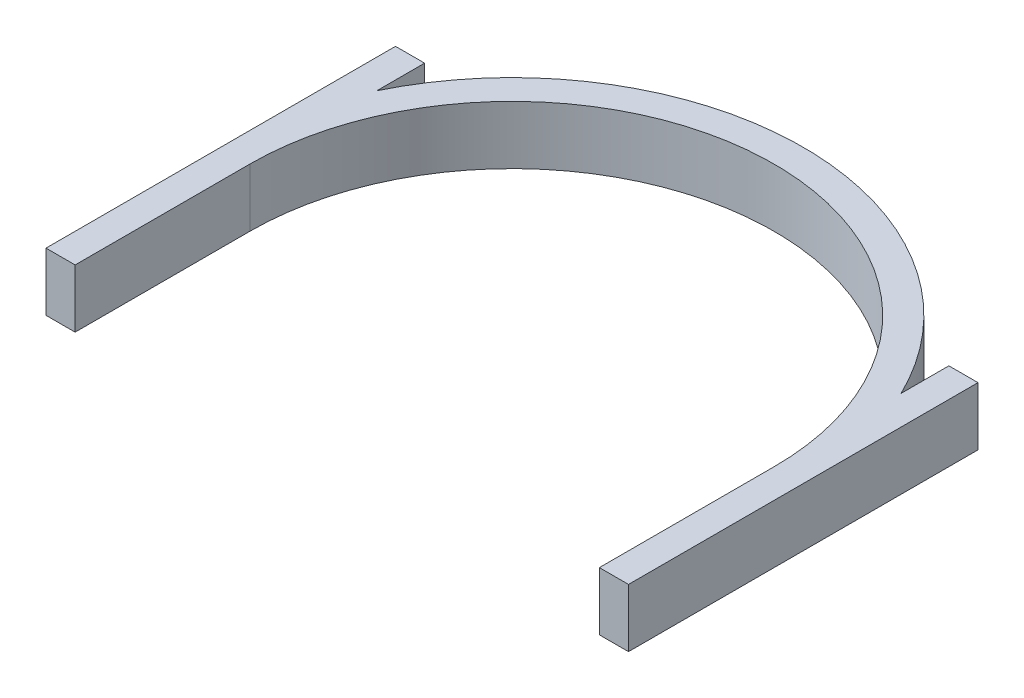
ISO-10303-21;
HEADER;
FILE_DESCRIPTION(('STEP AP214'),'2;1');
FILE_NAME('part.step','',(''),(''),'','','');
FILE_SCHEMA(('AUTOMOTIVE_DESIGN { 1 0 10303 214 1 1 1 1 }'));
ENDSEC;
DATA;
#1=APPLICATION_CONTEXT('core data for automotive mechanical design processes');
#2=APPLICATION_PROTOCOL_DEFINITION('international standard','automotive_design',2000,#1);
#3=PRODUCT_CONTEXT('',#1,'mechanical');
#4=PRODUCT('Part','Part','',(#3));
#5=PRODUCT_RELATED_PRODUCT_CATEGORY('part','',(#4));
#6=PRODUCT_DEFINITION_FORMATION('','',#4);
#7=PRODUCT_DEFINITION_CONTEXT('part definition',#1,'design');
#8=PRODUCT_DEFINITION('design','',#6,#7);
#9=PRODUCT_DEFINITION_SHAPE('','',#8);
#10=(LENGTH_UNIT() NAMED_UNIT(*) SI_UNIT(.MILLI.,.METRE.));
#11=(NAMED_UNIT(*) PLANE_ANGLE_UNIT() SI_UNIT($,.RADIAN.));
#12=(NAMED_UNIT(*) SI_UNIT($,.STERADIAN.) SOLID_ANGLE_UNIT());
#13=UNCERTAINTY_MEASURE_WITH_UNIT(LENGTH_MEASURE(1.E-05),#10,'distance_accuracy_value','');
#14=(GEOMETRIC_REPRESENTATION_CONTEXT(3) GLOBAL_UNCERTAINTY_ASSIGNED_CONTEXT((#13)) GLOBAL_UNIT_ASSIGNED_CONTEXT((#10,
#11,#12)) REPRESENTATION_CONTEXT('',''));
#15=CARTESIAN_POINT('',(0.,0.,0.));
#16=DIRECTION('',(0.,0.,1.));
#17=DIRECTION('',(1.,0.,0.));
#18=AXIS2_PLACEMENT_3D('',#15,#16,#17);
#19=CARTESIAN_POINT('',(0.,10.,0.));
#20=DIRECTION('',(0.,-1.,0.));
#21=DIRECTION('',(0.,0.,-1.));
#22=AXIS2_PLACEMENT_3D('',#19,#20,#21);
#23=CYLINDRICAL_SURFACE('',#22,50.);
#24=CARTESIAN_POINT('',(0.,0.,0.));
#25=DIRECTION('',(0.,1.,0.));
#26=DIRECTION('',(0.,0.,1.));
#27=AXIS2_PLACEMENT_3D('',#24,#25,#26);
#28=CIRCLE('',#27,50.);
#29=CARTESIAN_POINT('',(45.,0.,-21.7944947177034));
#30=VERTEX_POINT('',#29);
#31=CARTESIAN_POINT('',(-45.,0.,-21.7944947177034));
#32=VERTEX_POINT('',#31);
#33=EDGE_CURVE('E154',#30,#32,#28,.T.);
#34=ORIENTED_EDGE('',*,*,#33,.T.);
#35=DIRECTION('',(0.,-1.,0.));
#36=VECTOR('',#35,1.);
#37=CARTESIAN_POINT('',(-45.,10.,-21.7944947177034));
#38=LINE('',#37,#36);
#39=CARTESIAN_POINT('',(-45.,10.,-21.7944947177034));
#40=VERTEX_POINT('',#39);
#41=EDGE_CURVE('E11',#40,#32,#38,.T.);
#42=ORIENTED_EDGE('',*,*,#41,.F.);
#43=CARTESIAN_POINT('',(0.,10.,0.));
#44=DIRECTION('',(0.,1.,0.));
#45=DIRECTION('',(0.,0.,1.));
#46=AXIS2_PLACEMENT_3D('',#43,#44,#45);
#47=CIRCLE('',#46,50.);
#48=CARTESIAN_POINT('',(45.,10.,-21.7944947177034));
#49=VERTEX_POINT('',#48);
#50=EDGE_CURVE('E176',#49,#40,#47,.T.);
#51=ORIENTED_EDGE('',*,*,#50,.F.);
#52=DIRECTION('',(0.,-1.,0.));
#53=VECTOR('',#52,1.);
#54=CARTESIAN_POINT('',(45.,10.,-21.7944947177034));
#55=LINE('',#54,#53);
#56=EDGE_CURVE('E150',#49,#30,#55,.T.);
#57=ORIENTED_EDGE('',*,*,#56,.T.);
#58=EDGE_LOOP('',(#34,#42,#51,#57));
#59=FACE_BOUND('',#58,.T.);
#60=ADVANCED_FACE('F34',(#59),#23,.T.);
#61=CARTESIAN_POINT('',(-45.,10.,-30.));
#62=DIRECTION('',(-1.,0.,0.));
#63=DIRECTION('',(0.,0.,1.));
#64=AXIS2_PLACEMENT_3D('',#61,#62,#63);
#65=PLANE('',#64);
#66=DIRECTION('',(0.,0.,-1.));
#67=VECTOR('',#66,1.);
#68=CARTESIAN_POINT('',(-45.,0.,-30.));
#69=LINE('',#68,#67);
#70=CARTESIAN_POINT('',(-45.,0.,-30.));
#71=VERTEX_POINT('',#70);
#72=EDGE_CURVE('E157',#32,#71,#69,.T.);
#73=ORIENTED_EDGE('',*,*,#72,.T.);
#74=DIRECTION('',(0.,-1.,0.));
#75=VECTOR('',#74,1.);
#76=CARTESIAN_POINT('',(-45.,10.,-30.));
#77=LINE('',#76,#75);
#78=CARTESIAN_POINT('',(-45.,10.,-30.));
#79=VERTEX_POINT('',#78);
#80=EDGE_CURVE('E42',#79,#71,#77,.T.);
#81=ORIENTED_EDGE('',*,*,#80,.F.);
#82=DIRECTION('',(0.,0.,-1.));
#83=VECTOR('',#82,1.);
#84=CARTESIAN_POINT('',(-45.,10.,-30.));
#85=LINE('',#84,#83);
#86=EDGE_CURVE('E105',#40,#79,#85,.T.);
#87=ORIENTED_EDGE('',*,*,#86,.F.);
#88=ORIENTED_EDGE('',*,*,#41,.T.);
#89=EDGE_LOOP('',(#73,#81,#87,#88));
#90=FACE_BOUND('',#89,.T.);
#91=ADVANCED_FACE('F254',(#90),#65,.F.);
#92=CARTESIAN_POINT('',(-50.,10.,-30.));
#93=DIRECTION('',(0.,0.,1.));
#94=DIRECTION('',(1.,0.,0.));
#95=AXIS2_PLACEMENT_3D('',#92,#93,#94);
#96=PLANE('',#95);
#97=DIRECTION('',(-1.,0.,0.));
#98=VECTOR('',#97,1.);
#99=CARTESIAN_POINT('',(-50.,0.,-30.));
#100=LINE('',#99,#98);
#101=CARTESIAN_POINT('',(-50.,0.,-30.));
#102=VERTEX_POINT('',#101);
#103=EDGE_CURVE('E159',#71,#102,#100,.T.);
#104=ORIENTED_EDGE('',*,*,#103,.T.);
#105=DIRECTION('',(0.,-1.,0.));
#106=VECTOR('',#105,1.);
#107=CARTESIAN_POINT('',(-50.,10.,-30.));
#108=LINE('',#107,#106);
#109=CARTESIAN_POINT('',(-50.,10.,-30.));
#110=VERTEX_POINT('',#109);
#111=EDGE_CURVE('E195',#110,#102,#108,.T.);
#112=ORIENTED_EDGE('',*,*,#111,.F.);
#113=DIRECTION('',(-1.,0.,0.));
#114=VECTOR('',#113,1.);
#115=CARTESIAN_POINT('',(-50.,10.,-30.));
#116=LINE('',#115,#114);
#117=EDGE_CURVE('E203',#79,#110,#116,.T.);
#118=ORIENTED_EDGE('',*,*,#117,.F.);
#119=ORIENTED_EDGE('',*,*,#80,.T.);
#120=EDGE_LOOP('',(#104,#112,#118,#119));
#121=FACE_BOUND('',#120,.T.);
#122=ADVANCED_FACE('F201',(#121),#96,.F.);
#123=CARTESIAN_POINT('',(-50.,10.,-30.));
#124=DIRECTION('',(1.,0.,0.));
#125=DIRECTION('',(0.,0.,-1.));
#126=AXIS2_PLACEMENT_3D('',#123,#124,#125);
#127=PLANE('',#126);
#128=DIRECTION('',(0.,0.,1.));
#129=VECTOR('',#128,1.);
#130=CARTESIAN_POINT('',(-50.,0.,-30.));
#131=LINE('',#130,#129);
#132=CARTESIAN_POINT('',(-50.,0.,30.));
#133=VERTEX_POINT('',#132);
#134=EDGE_CURVE('E161',#102,#133,#131,.T.);
#135=ORIENTED_EDGE('',*,*,#134,.T.);
#136=DIRECTION('',(0.,-1.,0.));
#137=VECTOR('',#136,1.);
#138=CARTESIAN_POINT('',(-50.,10.,30.));
#139=LINE('',#138,#137);
#140=CARTESIAN_POINT('',(-50.,10.,30.));
#141=VERTEX_POINT('',#140);
#142=EDGE_CURVE('E192',#141,#133,#139,.T.);
#143=ORIENTED_EDGE('',*,*,#142,.F.);
#144=DIRECTION('',(0.,0.,1.));
#145=VECTOR('',#144,1.);
#146=CARTESIAN_POINT('',(-50.,10.,-30.));
#147=LINE('',#146,#145);
#148=EDGE_CURVE('E221',#110,#141,#147,.T.);
#149=ORIENTED_EDGE('',*,*,#148,.F.);
#150=ORIENTED_EDGE('',*,*,#111,.T.);
#151=EDGE_LOOP('',(#135,#143,#149,#150));
#152=FACE_BOUND('',#151,.T.);
#153=ADVANCED_FACE('F212',(#152),#127,.F.);
#154=CARTESIAN_POINT('',(-50.,10.,30.));
#155=DIRECTION('',(0.,0.,-1.));
#156=DIRECTION('',(-1.,0.,0.));
#157=AXIS2_PLACEMENT_3D('',#154,#155,#156);
#158=PLANE('',#157);
#159=DIRECTION('',(1.,0.,0.));
#160=VECTOR('',#159,1.);
#161=CARTESIAN_POINT('',(-50.,0.,30.));
#162=LINE('',#161,#160);
#163=CARTESIAN_POINT('',(-45.,0.,30.));
#164=VERTEX_POINT('',#163);
#165=EDGE_CURVE('E163',#133,#164,#162,.T.);
#166=ORIENTED_EDGE('',*,*,#165,.T.);
#167=DIRECTION('',(0.,-1.,0.));
#168=VECTOR('',#167,1.);
#169=CARTESIAN_POINT('',(-45.,10.,30.));
#170=LINE('',#169,#168);
#171=CARTESIAN_POINT('',(-45.,10.,30.));
#172=VERTEX_POINT('',#171);
#173=EDGE_CURVE('E189',#172,#164,#170,.T.);
#174=ORIENTED_EDGE('',*,*,#173,.F.);
#175=DIRECTION('',(1.,0.,0.));
#176=VECTOR('',#175,1.);
#177=CARTESIAN_POINT('',(-50.,10.,30.));
#178=LINE('',#177,#176);
#179=EDGE_CURVE('E218',#141,#172,#178,.T.);
#180=ORIENTED_EDGE('',*,*,#179,.F.);
#181=ORIENTED_EDGE('',*,*,#142,.T.);
#182=EDGE_LOOP('',(#166,#174,#180,#181));
#183=FACE_BOUND('',#182,.T.);
#184=ADVANCED_FACE('F216',(#183),#158,.F.);
#185=CARTESIAN_POINT('',(-45.,10.,0.));
#186=DIRECTION('',(-1.,0.,0.));
#187=DIRECTION('',(0.,0.,1.));
#188=AXIS2_PLACEMENT_3D('',#185,#186,#187);
#189=PLANE('',#188);
#190=DIRECTION('',(0.,0.,-1.));
#191=VECTOR('',#190,1.);
#192=CARTESIAN_POINT('',(-45.,0.,0.));
#193=LINE('',#192,#191);
#194=CARTESIAN_POINT('',(-45.,0.,0.));
#195=VERTEX_POINT('',#194);
#196=EDGE_CURVE('E165',#164,#195,#193,.T.);
#197=ORIENTED_EDGE('',*,*,#196,.T.);
#198=DIRECTION('',(0.,-1.,0.));
#199=VECTOR('',#198,1.);
#200=CARTESIAN_POINT('',(-45.,10.,0.));
#201=LINE('',#200,#199);
#202=CARTESIAN_POINT('',(-45.,10.,0.));
#203=VERTEX_POINT('',#202);
#204=EDGE_CURVE('E186',#203,#195,#201,.T.);
#205=ORIENTED_EDGE('',*,*,#204,.F.);
#206=DIRECTION('',(0.,0.,-1.));
#207=VECTOR('',#206,1.);
#208=CARTESIAN_POINT('',(-45.,10.,0.));
#209=LINE('',#208,#207);
#210=EDGE_CURVE('E220',#172,#203,#209,.T.);
#211=ORIENTED_EDGE('',*,*,#210,.F.);
#212=ORIENTED_EDGE('',*,*,#173,.T.);
#213=EDGE_LOOP('',(#197,#205,#211,#212));
#214=FACE_BOUND('',#213,.T.);
#215=ADVANCED_FACE('F267',(#214),#189,.F.);
#216=CARTESIAN_POINT('',(0.,10.,0.));
#217=DIRECTION('',(0.,-1.,0.));
#218=DIRECTION('',(0.,0.,-1.));
#219=AXIS2_PLACEMENT_3D('',#216,#217,#218);
#220=CYLINDRICAL_SURFACE('',#219,45.);
#221=CARTESIAN_POINT('',(0.,0.,0.));
#222=DIRECTION('',(0.,-1.,0.));
#223=DIRECTION('',(0.,0.,1.));
#224=AXIS2_PLACEMENT_3D('',#221,#222,#223);
#225=CIRCLE('',#224,45.);
#226=CARTESIAN_POINT('',(45.,0.,0.));
#227=VERTEX_POINT('',#226);
#228=EDGE_CURVE('E167',#195,#227,#225,.T.);
#229=ORIENTED_EDGE('',*,*,#228,.T.);
#230=DIRECTION('',(0.,-1.,0.));
#231=VECTOR('',#230,1.);
#232=CARTESIAN_POINT('',(45.,10.,0.));
#233=LINE('',#232,#231);
#234=CARTESIAN_POINT('',(45.,10.,0.));
#235=VERTEX_POINT('',#234);
#236=EDGE_CURVE('E183',#235,#227,#233,.T.);
#237=ORIENTED_EDGE('',*,*,#236,.F.);
#238=CARTESIAN_POINT('',(0.,10.,0.));
#239=DIRECTION('',(0.,-1.,0.));
#240=DIRECTION('',(0.,0.,1.));
#241=AXIS2_PLACEMENT_3D('',#238,#239,#240);
#242=CIRCLE('',#241,45.);
#243=EDGE_CURVE('E223',#203,#235,#242,.T.);
#244=ORIENTED_EDGE('',*,*,#243,.F.);
#245=ORIENTED_EDGE('',*,*,#204,.T.);
#246=EDGE_LOOP('',(#229,#237,#244,#245));
#247=FACE_BOUND('',#246,.T.);
#248=ADVANCED_FACE('F270',(#247),#220,.F.);
#249=CARTESIAN_POINT('',(45.,10.,0.));
#250=DIRECTION('',(1.,0.,0.));
#251=DIRECTION('',(0.,0.,-1.));
#252=AXIS2_PLACEMENT_3D('',#249,#250,#251);
#253=PLANE('',#252);
#254=DIRECTION('',(0.,0.,1.));
#255=VECTOR('',#254,1.);
#256=CARTESIAN_POINT('',(45.,0.,0.));
#257=LINE('',#256,#255);
#258=CARTESIAN_POINT('',(45.,0.,30.));
#259=VERTEX_POINT('',#258);
#260=EDGE_CURVE('E169',#227,#259,#257,.T.);
#261=ORIENTED_EDGE('',*,*,#260,.T.);
#262=DIRECTION('',(0.,-1.,0.));
#263=VECTOR('',#262,1.);
#264=CARTESIAN_POINT('',(45.,10.,30.));
#265=LINE('',#264,#263);
#266=CARTESIAN_POINT('',(45.,10.,30.));
#267=VERTEX_POINT('',#266);
#268=EDGE_CURVE('E180',#267,#259,#265,.T.);
#269=ORIENTED_EDGE('',*,*,#268,.F.);
#270=DIRECTION('',(0.,0.,1.));
#271=VECTOR('',#270,1.);
#272=CARTESIAN_POINT('',(45.,10.,0.));
#273=LINE('',#272,#271);
#274=EDGE_CURVE('E229',#235,#267,#273,.T.);
#275=ORIENTED_EDGE('',*,*,#274,.F.);
#276=ORIENTED_EDGE('',*,*,#236,.T.);
#277=EDGE_LOOP('',(#261,#269,#275,#276));
#278=FACE_BOUND('',#277,.T.);
#279=ADVANCED_FACE('F235',(#278),#253,.F.);
#280=CARTESIAN_POINT('',(45.,10.,30.));
#281=DIRECTION('',(0.,0.,-1.));
#282=DIRECTION('',(-1.,0.,0.));
#283=AXIS2_PLACEMENT_3D('',#280,#281,#282);
#284=PLANE('',#283);
#285=DIRECTION('',(1.,0.,0.));
#286=VECTOR('',#285,1.);
#287=CARTESIAN_POINT('',(45.,0.,30.));
#288=LINE('',#287,#286);
#289=CARTESIAN_POINT('',(50.,0.,30.));
#290=VERTEX_POINT('',#289);
#291=EDGE_CURVE('E171',#259,#290,#288,.T.);
#292=ORIENTED_EDGE('',*,*,#291,.T.);
#293=DIRECTION('',(0.,-1.,0.));
#294=VECTOR('',#293,1.);
#295=CARTESIAN_POINT('',(50.,10.,30.));
#296=LINE('',#295,#294);
#297=CARTESIAN_POINT('',(50.,10.,30.));
#298=VERTEX_POINT('',#297);
#299=EDGE_CURVE('E145',#298,#290,#296,.T.);
#300=ORIENTED_EDGE('',*,*,#299,.F.);
#301=DIRECTION('',(1.,0.,0.));
#302=VECTOR('',#301,1.);
#303=CARTESIAN_POINT('',(45.,10.,30.));
#304=LINE('',#303,#302);
#305=EDGE_CURVE('E136',#267,#298,#304,.T.);
#306=ORIENTED_EDGE('',*,*,#305,.F.);
#307=ORIENTED_EDGE('',*,*,#268,.T.);
#308=EDGE_LOOP('',(#292,#300,#306,#307));
#309=FACE_BOUND('',#308,.T.);
#310=ADVANCED_FACE('F239',(#309),#284,.F.);
#311=CARTESIAN_POINT('',(50.,10.,-30.));
#312=DIRECTION('',(-1.,0.,0.));
#313=DIRECTION('',(0.,0.,1.));
#314=AXIS2_PLACEMENT_3D('',#311,#312,#313);
#315=PLANE('',#314);
#316=DIRECTION('',(0.,0.,-1.));
#317=VECTOR('',#316,1.);
#318=CARTESIAN_POINT('',(50.,0.,-30.));
#319=LINE('',#318,#317);
#320=CARTESIAN_POINT('',(50.,0.,-30.));
#321=VERTEX_POINT('',#320);
#322=EDGE_CURVE('E144',#290,#321,#319,.T.);
#323=ORIENTED_EDGE('',*,*,#322,.T.);
#324=DIRECTION('',(0.,-1.,0.));
#325=VECTOR('',#324,1.);
#326=CARTESIAN_POINT('',(50.,10.,-30.));
#327=LINE('',#326,#325);
#328=CARTESIAN_POINT('',(50.,10.,-30.));
#329=VERTEX_POINT('',#328);
#330=EDGE_CURVE('E141',#329,#321,#327,.T.);
#331=ORIENTED_EDGE('',*,*,#330,.F.);
#332=DIRECTION('',(0.,0.,-1.));
#333=VECTOR('',#332,1.);
#334=CARTESIAN_POINT('',(50.,10.,-30.));
#335=LINE('',#334,#333);
#336=EDGE_CURVE('E130',#298,#329,#335,.T.);
#337=ORIENTED_EDGE('',*,*,#336,.F.);
#338=ORIENTED_EDGE('',*,*,#299,.T.);
#339=EDGE_LOOP('',(#323,#331,#337,#338));
#340=FACE_BOUND('',#339,.T.);
#341=ADVANCED_FACE('F142',(#340),#315,.F.);
#342=CARTESIAN_POINT('',(45.,10.,-30.));
#343=DIRECTION('',(0.,0.,1.));
#344=DIRECTION('',(1.,0.,0.));
#345=AXIS2_PLACEMENT_3D('',#342,#343,#344);
#346=PLANE('',#345);
#347=DIRECTION('',(-1.,0.,0.));
#348=VECTOR('',#347,1.);
#349=CARTESIAN_POINT('',(45.,0.,-30.));
#350=LINE('',#349,#348);
#351=CARTESIAN_POINT('',(45.,0.,-30.));
#352=VERTEX_POINT('',#351);
#353=EDGE_CURVE('E91',#321,#352,#350,.T.);
#354=ORIENTED_EDGE('',*,*,#353,.T.);
#355=DIRECTION('',(0.,-1.,0.));
#356=VECTOR('',#355,1.);
#357=CARTESIAN_POINT('',(45.,10.,-30.));
#358=LINE('',#357,#356);
#359=CARTESIAN_POINT('',(45.,10.,-30.));
#360=VERTEX_POINT('',#359);
#361=EDGE_CURVE('E146',#360,#352,#358,.T.);
#362=ORIENTED_EDGE('',*,*,#361,.F.);
#363=DIRECTION('',(-1.,0.,0.));
#364=VECTOR('',#363,1.);
#365=CARTESIAN_POINT('',(45.,10.,-30.));
#366=LINE('',#365,#364);
#367=EDGE_CURVE('E134',#329,#360,#366,.T.);
#368=ORIENTED_EDGE('',*,*,#367,.F.);
#369=ORIENTED_EDGE('',*,*,#330,.T.);
#370=EDGE_LOOP('',(#354,#362,#368,#369));
#371=FACE_BOUND('',#370,.T.);
#372=ADVANCED_FACE('F148',(#371),#346,.F.);
#373=CARTESIAN_POINT('',(45.,10.,-30.));
#374=DIRECTION('',(1.,0.,0.));
#375=DIRECTION('',(0.,0.,-1.));
#376=AXIS2_PLACEMENT_3D('',#373,#374,#375);
#377=PLANE('',#376);
#378=DIRECTION('',(0.,0.,1.));
#379=VECTOR('',#378,1.);
#380=CARTESIAN_POINT('',(45.,0.,-30.));
#381=LINE('',#380,#379);
#382=EDGE_CURVE('E97',#352,#30,#381,.T.);
#383=ORIENTED_EDGE('',*,*,#382,.T.);
#384=ORIENTED_EDGE('',*,*,#56,.F.);
#385=DIRECTION('',(0.,0.,1.));
#386=VECTOR('',#385,1.);
#387=CARTESIAN_POINT('',(45.,10.,-30.));
#388=LINE('',#387,#386);
#389=EDGE_CURVE('E50',#360,#49,#388,.T.);
#390=ORIENTED_EDGE('',*,*,#389,.F.);
#391=ORIENTED_EDGE('',*,*,#361,.T.);
#392=EDGE_LOOP('',(#383,#384,#390,#391));
#393=FACE_BOUND('',#392,.T.);
#394=ADVANCED_FACE('F243',(#393),#377,.F.);
#395=CARTESIAN_POINT('',(0.,10.,0.));
#396=DIRECTION('',(0.,1.,0.));
#397=DIRECTION('',(0.,0.,1.));
#398=AXIS2_PLACEMENT_3D('',#395,#396,#397);
#399=PLANE('',#398);
#400=ORIENTED_EDGE('',*,*,#50,.T.);
#401=ORIENTED_EDGE('',*,*,#86,.T.);
#402=ORIENTED_EDGE('',*,*,#117,.T.);
#403=ORIENTED_EDGE('',*,*,#148,.T.);
#404=ORIENTED_EDGE('',*,*,#179,.T.);
#405=ORIENTED_EDGE('',*,*,#210,.T.);
#406=ORIENTED_EDGE('',*,*,#243,.T.);
#407=ORIENTED_EDGE('',*,*,#274,.T.);
#408=ORIENTED_EDGE('',*,*,#305,.T.);
#409=ORIENTED_EDGE('',*,*,#336,.T.);
#410=ORIENTED_EDGE('',*,*,#367,.T.);
#411=ORIENTED_EDGE('',*,*,#389,.T.);
#412=EDGE_LOOP('',(#400,#401,#402,#403,#404,#405,#406,#407,#408,#409,#410,#411));
#413=FACE_BOUND('',#412,.T.);
#414=ADVANCED_FACE('F132',(#413),#399,.T.);
#415=CARTESIAN_POINT('',(0.,0.,0.));
#416=DIRECTION('',(0.,1.,0.));
#417=DIRECTION('',(0.,0.,1.));
#418=AXIS2_PLACEMENT_3D('',#415,#416,#417);
#419=PLANE('',#418);
#420=ORIENTED_EDGE('',*,*,#33,.F.);
#421=ORIENTED_EDGE('',*,*,#382,.F.);
#422=ORIENTED_EDGE('',*,*,#353,.F.);
#423=ORIENTED_EDGE('',*,*,#322,.F.);
#424=ORIENTED_EDGE('',*,*,#291,.F.);
#425=ORIENTED_EDGE('',*,*,#260,.F.);
#426=ORIENTED_EDGE('',*,*,#228,.F.);
#427=ORIENTED_EDGE('',*,*,#196,.F.);
#428=ORIENTED_EDGE('',*,*,#165,.F.);
#429=ORIENTED_EDGE('',*,*,#134,.F.);
#430=ORIENTED_EDGE('',*,*,#103,.F.);
#431=ORIENTED_EDGE('',*,*,#72,.F.);
#432=EDGE_LOOP('',(#420,#421,#422,#423,#424,#425,#426,#427,#428,#429,#430,#431));
#433=FACE_BOUND('',#432,.T.);
#434=ADVANCED_FACE('F207',(#433),#419,.F.);
#435=CLOSED_SHELL('',(#60,#91,#122,#153,#184,#215,#248,#279,#310,#341,#372,#394,#414,#434));
#436=MANIFOLD_SOLID_BREP('B2',#435);
#437=ADVANCED_BREP_SHAPE_REPRESENTATION('',(#18,#436),#14);
#438=SHAPE_DEFINITION_REPRESENTATION(#9,#437);
ENDSEC;
END-ISO-10303-21;
